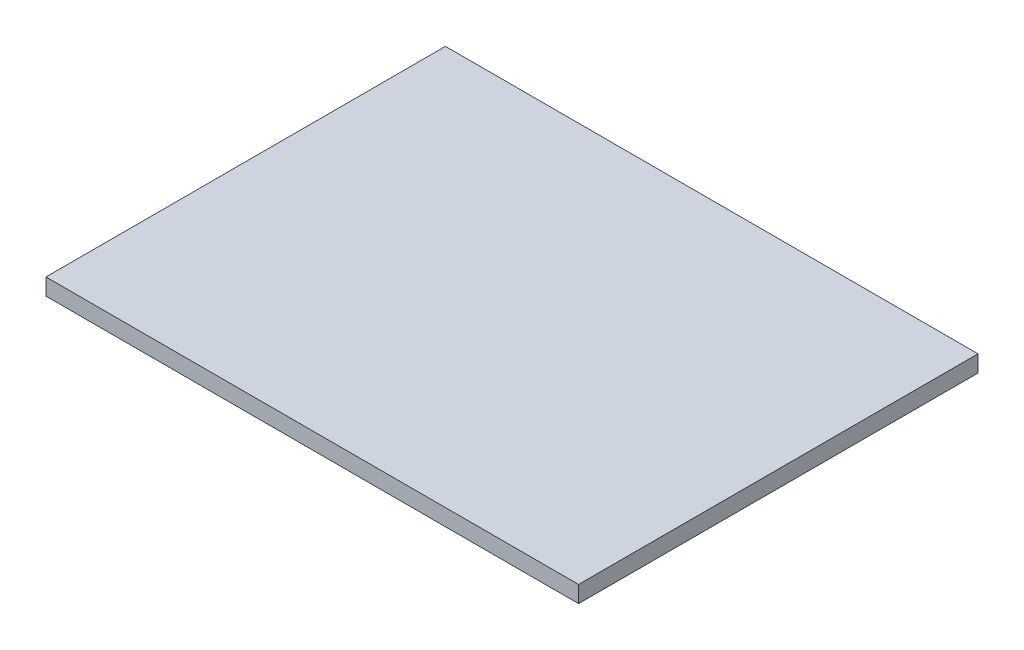
ISO-10303-21;
HEADER;
FILE_DESCRIPTION(('STEP AP214'),'2;1');
FILE_NAME('part.step','',(''),(''),'','','');
FILE_SCHEMA(('AUTOMOTIVE_DESIGN { 1 0 10303 214 1 1 1 1 }'));
ENDSEC;
DATA;
#1=APPLICATION_CONTEXT('core data for automotive mechanical design processes');
#2=APPLICATION_PROTOCOL_DEFINITION('international standard','automotive_design',2000,#1);
#3=PRODUCT_CONTEXT('',#1,'mechanical');
#4=PRODUCT('Part','Part','',(#3));
#5=PRODUCT_RELATED_PRODUCT_CATEGORY('part','',(#4));
#6=PRODUCT_DEFINITION_FORMATION('','',#4);
#7=PRODUCT_DEFINITION_CONTEXT('part definition',#1,'design');
#8=PRODUCT_DEFINITION('design','',#6,#7);
#9=PRODUCT_DEFINITION_SHAPE('','',#8);
#10=(LENGTH_UNIT() NAMED_UNIT(*) SI_UNIT(.MILLI.,.METRE.));
#11=(NAMED_UNIT(*) PLANE_ANGLE_UNIT() SI_UNIT($,.RADIAN.));
#12=(NAMED_UNIT(*) SI_UNIT($,.STERADIAN.) SOLID_ANGLE_UNIT());
#13=UNCERTAINTY_MEASURE_WITH_UNIT(LENGTH_MEASURE(1.E-05),#10,'distance_accuracy_value','');
#14=(GEOMETRIC_REPRESENTATION_CONTEXT(3) GLOBAL_UNCERTAINTY_ASSIGNED_CONTEXT((#13)) GLOBAL_UNIT_ASSIGNED_CONTEXT((#10,
#11,#12)) REPRESENTATION_CONTEXT('',''));
#15=CARTESIAN_POINT('',(0.,0.,0.));
#16=DIRECTION('',(0.,0.,1.));
#17=DIRECTION('',(1.,0.,0.));
#18=AXIS2_PLACEMENT_3D('',#15,#16,#17);
#19=CARTESIAN_POINT('',(101.6,6.35,76.2));
#20=DIRECTION('',(-1.,0.,0.));
#21=DIRECTION('',(0.,0.,1.));
#22=AXIS2_PLACEMENT_3D('',#19,#20,#21);
#23=PLANE('',#22);
#24=DIRECTION('',(0.,0.,-1.));
#25=VECTOR('',#24,1.);
#26=CARTESIAN_POINT('',(101.6,0.,76.2));
#27=LINE('',#26,#25);
#28=CARTESIAN_POINT('',(101.6,0.,76.2));
#29=VERTEX_POINT('',#28);
#30=CARTESIAN_POINT('',(101.6,0.,-76.2));
#31=VERTEX_POINT('',#30);
#32=EDGE_CURVE('E97',#29,#31,#27,.T.);
#33=ORIENTED_EDGE('',*,*,#32,.T.);
#34=DIRECTION('',(0.,-1.,0.));
#35=VECTOR('',#34,1.);
#36=CARTESIAN_POINT('',(101.6,6.35,-76.2));
#37=LINE('',#36,#35);
#38=CARTESIAN_POINT('',(101.6,6.35,-76.2));
#39=VERTEX_POINT('',#38);
#40=EDGE_CURVE('E11',#39,#31,#37,.T.);
#41=ORIENTED_EDGE('',*,*,#40,.F.);
#42=DIRECTION('',(0.,0.,-1.));
#43=VECTOR('',#42,1.);
#44=CARTESIAN_POINT('',(101.6,6.35,76.2));
#45=LINE('',#44,#43);
#46=CARTESIAN_POINT('',(101.6,6.35,76.2));
#47=VERTEX_POINT('',#46);
#48=EDGE_CURVE('E85',#47,#39,#45,.T.);
#49=ORIENTED_EDGE('',*,*,#48,.F.);
#50=DIRECTION('',(0.,-1.,0.));
#51=VECTOR('',#50,1.);
#52=CARTESIAN_POINT('',(101.6,6.35,76.2));
#53=LINE('',#52,#51);
#54=EDGE_CURVE('E93',#47,#29,#53,.T.);
#55=ORIENTED_EDGE('',*,*,#54,.T.);
#56=EDGE_LOOP('',(#33,#41,#49,#55));
#57=FACE_BOUND('',#56,.T.);
#58=ADVANCED_FACE('F34',(#57),#23,.F.);
#59=CARTESIAN_POINT('',(-101.6,6.35,-76.2));
#60=DIRECTION('',(0.,0.,1.));
#61=DIRECTION('',(1.,0.,0.));
#62=AXIS2_PLACEMENT_3D('',#59,#60,#61);
#63=PLANE('',#62);
#64=DIRECTION('',(-1.,0.,0.));
#65=VECTOR('',#64,1.);
#66=CARTESIAN_POINT('',(-101.6,0.,-76.2));
#67=LINE('',#66,#65);
#68=CARTESIAN_POINT('',(-101.6,0.,-76.2));
#69=VERTEX_POINT('',#68);
#70=EDGE_CURVE('E89',#31,#69,#67,.T.);
#71=ORIENTED_EDGE('',*,*,#70,.T.);
#72=DIRECTION('',(0.,-1.,0.));
#73=VECTOR('',#72,1.);
#74=CARTESIAN_POINT('',(-101.6,6.35,-76.2));
#75=LINE('',#74,#73);
#76=CARTESIAN_POINT('',(-101.6,6.35,-76.2));
#77=VERTEX_POINT('',#76);
#78=EDGE_CURVE('E42',#77,#69,#75,.T.);
#79=ORIENTED_EDGE('',*,*,#78,.F.);
#80=DIRECTION('',(-1.,0.,0.));
#81=VECTOR('',#80,1.);
#82=CARTESIAN_POINT('',(-101.6,6.35,-76.2));
#83=LINE('',#82,#81);
#84=EDGE_CURVE('E80',#39,#77,#83,.T.);
#85=ORIENTED_EDGE('',*,*,#84,.F.);
#86=ORIENTED_EDGE('',*,*,#40,.T.);
#87=EDGE_LOOP('',(#71,#79,#85,#86));
#88=FACE_BOUND('',#87,.T.);
#89=ADVANCED_FACE('F88',(#88),#63,.F.);
#90=CARTESIAN_POINT('',(-101.6,6.35,76.2));
#91=DIRECTION('',(1.,0.,0.));
#92=DIRECTION('',(0.,0.,-1.));
#93=AXIS2_PLACEMENT_3D('',#90,#91,#92);
#94=PLANE('',#93);
#95=DIRECTION('',(0.,0.,1.));
#96=VECTOR('',#95,1.);
#97=CARTESIAN_POINT('',(-101.6,0.,76.2));
#98=LINE('',#97,#96);
#99=CARTESIAN_POINT('',(-101.6,0.,76.2));
#100=VERTEX_POINT('',#99);
#101=EDGE_CURVE('E67',#69,#100,#98,.T.);
#102=ORIENTED_EDGE('',*,*,#101,.T.);
#103=DIRECTION('',(0.,-1.,0.));
#104=VECTOR('',#103,1.);
#105=CARTESIAN_POINT('',(-101.6,6.35,76.2));
#106=LINE('',#105,#104);
#107=CARTESIAN_POINT('',(-101.6,6.35,76.2));
#108=VERTEX_POINT('',#107);
#109=EDGE_CURVE('E90',#108,#100,#106,.T.);
#110=ORIENTED_EDGE('',*,*,#109,.F.);
#111=DIRECTION('',(0.,0.,1.));
#112=VECTOR('',#111,1.);
#113=CARTESIAN_POINT('',(-101.6,6.35,76.2));
#114=LINE('',#113,#112);
#115=EDGE_CURVE('E83',#77,#108,#114,.T.);
#116=ORIENTED_EDGE('',*,*,#115,.F.);
#117=ORIENTED_EDGE('',*,*,#78,.T.);
#118=EDGE_LOOP('',(#102,#110,#116,#117));
#119=FACE_BOUND('',#118,.T.);
#120=ADVANCED_FACE('F91',(#119),#94,.F.);
#121=CARTESIAN_POINT('',(-101.6,6.35,76.2));
#122=DIRECTION('',(0.,0.,-1.));
#123=DIRECTION('',(-1.,0.,0.));
#124=AXIS2_PLACEMENT_3D('',#121,#122,#123);
#125=PLANE('',#124);
#126=DIRECTION('',(1.,0.,0.));
#127=VECTOR('',#126,1.);
#128=CARTESIAN_POINT('',(-101.6,0.,76.2));
#129=LINE('',#128,#127);
#130=EDGE_CURVE('E73',#100,#29,#129,.T.);
#131=ORIENTED_EDGE('',*,*,#130,.T.);
#132=ORIENTED_EDGE('',*,*,#54,.F.);
#133=DIRECTION('',(1.,0.,0.));
#134=VECTOR('',#133,1.);
#135=CARTESIAN_POINT('',(-101.6,6.35,76.2));
#136=LINE('',#135,#134);
#137=EDGE_CURVE('E50',#108,#47,#136,.T.);
#138=ORIENTED_EDGE('',*,*,#137,.F.);
#139=ORIENTED_EDGE('',*,*,#109,.T.);
#140=EDGE_LOOP('',(#131,#132,#138,#139));
#141=FACE_BOUND('',#140,.T.);
#142=ADVANCED_FACE('F104',(#141),#125,.F.);
#143=CARTESIAN_POINT('',(0.,6.35,0.));
#144=DIRECTION('',(0.,-1.,0.));
#145=DIRECTION('',(0.,0.,-1.));
#146=AXIS2_PLACEMENT_3D('',#143,#144,#145);
#147=PLANE('',#146);
#148=ORIENTED_EDGE('',*,*,#48,.T.);
#149=ORIENTED_EDGE('',*,*,#84,.T.);
#150=ORIENTED_EDGE('',*,*,#115,.T.);
#151=ORIENTED_EDGE('',*,*,#137,.T.);
#152=EDGE_LOOP('',(#148,#149,#150,#151));
#153=FACE_BOUND('',#152,.T.);
#154=ADVANCED_FACE('F81',(#153),#147,.F.);
#155=CARTESIAN_POINT('',(0.,0.,0.));
#156=DIRECTION('',(0.,-1.,0.));
#157=DIRECTION('',(0.,0.,-1.));
#158=AXIS2_PLACEMENT_3D('',#155,#156,#157);
#159=PLANE('',#158);
#160=ORIENTED_EDGE('',*,*,#32,.F.);
#161=ORIENTED_EDGE('',*,*,#130,.F.);
#162=ORIENTED_EDGE('',*,*,#101,.F.);
#163=ORIENTED_EDGE('',*,*,#70,.F.);
#164=EDGE_LOOP('',(#160,#161,#162,#163));
#165=FACE_BOUND('',#164,.T.);
#166=ADVANCED_FACE('F107',(#165),#159,.T.);
#167=CLOSED_SHELL('',(#58,#89,#120,#142,#154,#166));
#168=MANIFOLD_SOLID_BREP('B2',#167);
#169=ADVANCED_BREP_SHAPE_REPRESENTATION('',(#18,#168),#14);
#170=SHAPE_DEFINITION_REPRESENTATION(#9,#169);
ENDSEC;
END-ISO-10303-21;
